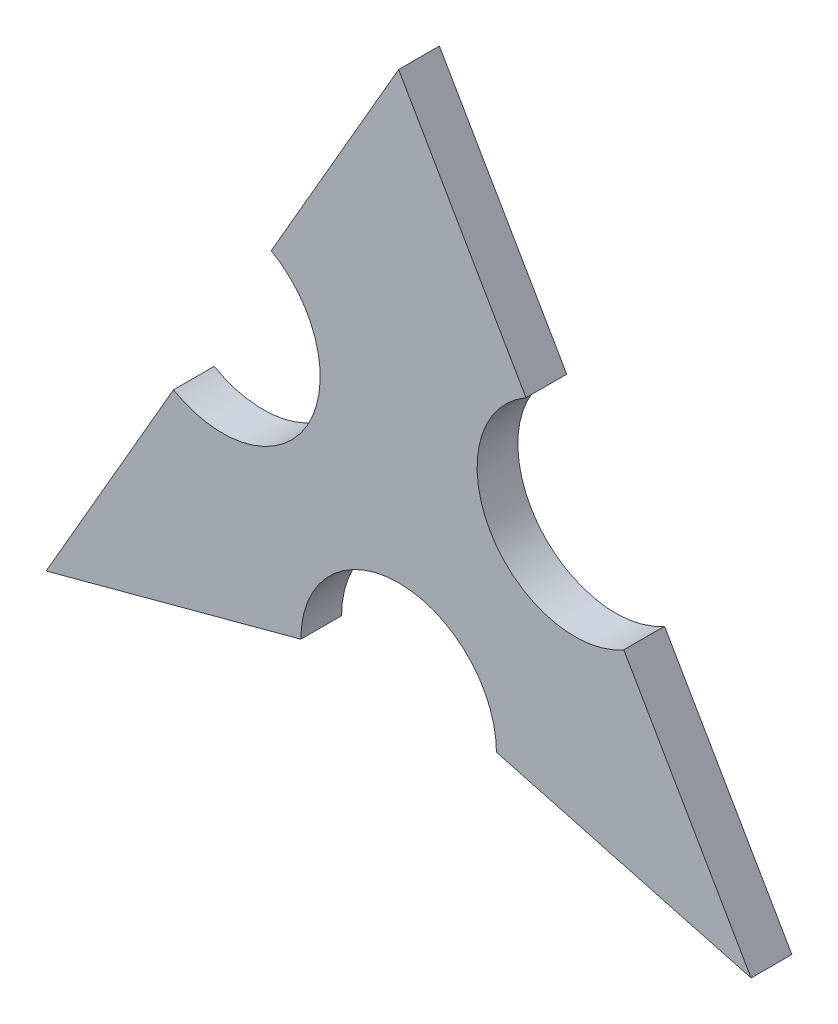
ISO-10303-21;
HEADER;
FILE_DESCRIPTION(('STEP AP214'),'2;1');
FILE_NAME('part.step','',(''),(''),'','','');
FILE_SCHEMA(('AUTOMOTIVE_DESIGN { 1 0 10303 214 1 1 1 1 }'));
ENDSEC;
DATA;
#1=APPLICATION_CONTEXT('core data for automotive mechanical design processes');
#2=APPLICATION_PROTOCOL_DEFINITION('international standard','automotive_design',2000,#1);
#3=PRODUCT_CONTEXT('',#1,'mechanical');
#4=PRODUCT('Part','Part','',(#3));
#5=PRODUCT_RELATED_PRODUCT_CATEGORY('part','',(#4));
#6=PRODUCT_DEFINITION_FORMATION('','',#4);
#7=PRODUCT_DEFINITION_CONTEXT('part definition',#1,'design');
#8=PRODUCT_DEFINITION('design','',#6,#7);
#9=PRODUCT_DEFINITION_SHAPE('','',#8);
#10=(LENGTH_UNIT() NAMED_UNIT(*) SI_UNIT(.MILLI.,.METRE.));
#11=(NAMED_UNIT(*) PLANE_ANGLE_UNIT() SI_UNIT($,.RADIAN.));
#12=(NAMED_UNIT(*) SI_UNIT($,.STERADIAN.) SOLID_ANGLE_UNIT());
#13=UNCERTAINTY_MEASURE_WITH_UNIT(LENGTH_MEASURE(1.E-05),#10,'distance_accuracy_value','');
#14=(GEOMETRIC_REPRESENTATION_CONTEXT(3) GLOBAL_UNCERTAINTY_ASSIGNED_CONTEXT((#13)) GLOBAL_UNIT_ASSIGNED_CONTEXT((#10,
#11,#12)) REPRESENTATION_CONTEXT('',''));
#15=CARTESIAN_POINT('',(0.,0.,0.));
#16=DIRECTION('',(0.,0.,1.));
#17=DIRECTION('',(1.,0.,0.));
#18=AXIS2_PLACEMENT_3D('',#15,#16,#17);
#19=CARTESIAN_POINT('',(0.,149.822394854708,5.));
#20=DIRECTION('',(-0.866025403784439,-0.5,0.));
#21=DIRECTION('',(0.5,-0.866025403784439,0.));
#22=AXIS2_PLACEMENT_3D('',#19,#20,#21);
#23=PLANE('',#22);
#24=DIRECTION('',(-0.5,0.866025403784439,0.));
#25=VECTOR('',#24,1.);
#26=CARTESIAN_POINT('',(0.,149.822394854708,-5.));
#27=LINE('',#26,#25);
#28=CARTESIAN_POINT('',(31.25,95.6958071181804,-5.));
#29=VERTEX_POINT('',#28);
#30=CARTESIAN_POINT('',(0.,149.822394854708,-5.));
#31=VERTEX_POINT('',#30);
#32=EDGE_CURVE('E143',#29,#31,#27,.T.);
#33=ORIENTED_EDGE('',*,*,#32,.T.);
#34=DIRECTION('',(0.,0.,-1.));
#35=VECTOR('',#34,1.);
#36=CARTESIAN_POINT('',(0.,149.822394854708,5.));
#37=LINE('',#36,#35);
#38=CARTESIAN_POINT('',(0.,149.822394854708,5.));
#39=VERTEX_POINT('',#38);
#40=EDGE_CURVE('E11',#39,#31,#37,.T.);
#41=ORIENTED_EDGE('',*,*,#40,.F.);
#42=DIRECTION('',(-0.5,0.866025403784439,0.));
#43=VECTOR('',#42,1.);
#44=CARTESIAN_POINT('',(0.,149.822394854708,5.));
#45=LINE('',#44,#43);
#46=CARTESIAN_POINT('',(31.25,95.6958071181804,5.));
#47=VERTEX_POINT('',#46);
#48=EDGE_CURVE('E159',#47,#39,#45,.T.);
#49=ORIENTED_EDGE('',*,*,#48,.F.);
#50=DIRECTION('',(0.,0.,-1.));
#51=VECTOR('',#50,1.);
#52=CARTESIAN_POINT('',(31.25,95.6958071181804,5.));
#53=LINE('',#52,#51);
#54=EDGE_CURVE('E139',#47,#29,#53,.T.);
#55=ORIENTED_EDGE('',*,*,#54,.T.);
#56=EDGE_LOOP('',(#33,#41,#49,#55));
#57=FACE_BOUND('',#56,.T.);
#58=ADVANCED_FACE('F41',(#57),#23,.F.);
#59=CARTESIAN_POINT('',(0.,149.822394854708,5.));
#60=DIRECTION('',(0.866025403784439,-0.5,0.));
#61=DIRECTION('',(0.5,0.866025403784439,0.));
#62=AXIS2_PLACEMENT_3D('',#59,#60,#61);
#63=PLANE('',#62);
#64=DIRECTION('',(-0.5,-0.866025403784439,0.));
#65=VECTOR('',#64,1.);
#66=CARTESIAN_POINT('',(0.,149.822394854708,-5.));
#67=LINE('',#66,#65);
#68=CARTESIAN_POINT('',(-31.25,95.6958071181804,-5.));
#69=VERTEX_POINT('',#68);
#70=EDGE_CURVE('E146',#31,#69,#67,.T.);
#71=ORIENTED_EDGE('',*,*,#70,.T.);
#72=DIRECTION('',(0.,0.,-1.));
#73=VECTOR('',#72,1.);
#74=CARTESIAN_POINT('',(-31.25,95.6958071181804,5.));
#75=LINE('',#74,#73);
#76=CARTESIAN_POINT('',(-31.25,95.6958071181804,5.));
#77=VERTEX_POINT('',#76);
#78=EDGE_CURVE('E49',#77,#69,#75,.T.);
#79=ORIENTED_EDGE('',*,*,#78,.F.);
#80=DIRECTION('',(-0.5,-0.866025403784439,0.));
#81=VECTOR('',#80,1.);
#82=CARTESIAN_POINT('',(0.,149.822394854708,5.));
#83=LINE('',#82,#81);
#84=EDGE_CURVE('E103',#39,#77,#83,.T.);
#85=ORIENTED_EDGE('',*,*,#84,.F.);
#86=ORIENTED_EDGE('',*,*,#40,.T.);
#87=EDGE_LOOP('',(#71,#79,#85,#86));
#88=FACE_BOUND('',#87,.T.);
#89=ADVANCED_FACE('F202',(#88),#63,.F.);
#90=CARTESIAN_POINT('',(-43.25,74.9111974273539,5.));
#91=DIRECTION('',(0.,0.,-1.));
#92=DIRECTION('',(-1.,0.,0.));
#93=AXIS2_PLACEMENT_3D('',#90,#91,#92);
#94=CYLINDRICAL_SURFACE('',#93,24.);
#95=CARTESIAN_POINT('',(-43.25,74.9111974273539,-5.));
#96=DIRECTION('',(0.,0.,-1.));
#97=DIRECTION('',(1.,0.,0.));
#98=AXIS2_PLACEMENT_3D('',#95,#96,#97);
#99=CIRCLE('',#98,24.);
#100=CARTESIAN_POINT('',(-55.25,54.1265877365274,-5.));
#101=VERTEX_POINT('',#100);
#102=EDGE_CURVE('E148',#69,#101,#99,.T.);
#103=ORIENTED_EDGE('',*,*,#102,.T.);
#104=DIRECTION('',(0.,0.,-1.));
#105=VECTOR('',#104,1.);
#106=CARTESIAN_POINT('',(-55.25,54.1265877365274,5.));
#107=LINE('',#106,#105);
#108=CARTESIAN_POINT('',(-55.25,54.1265877365274,5.));
#109=VERTEX_POINT('',#108);
#110=EDGE_CURVE('E169',#109,#101,#107,.T.);
#111=ORIENTED_EDGE('',*,*,#110,.F.);
#112=CARTESIAN_POINT('',(-43.25,74.9111974273539,5.));
#113=DIRECTION('',(0.,0.,-1.));
#114=DIRECTION('',(1.,0.,0.));
#115=AXIS2_PLACEMENT_3D('',#112,#113,#114);
#116=CIRCLE('',#115,24.);
#117=EDGE_CURVE('E177',#77,#109,#116,.T.);
#118=ORIENTED_EDGE('',*,*,#117,.F.);
#119=ORIENTED_EDGE('',*,*,#78,.T.);
#120=EDGE_LOOP('',(#103,#111,#118,#119));
#121=FACE_BOUND('',#120,.T.);
#122=ADVANCED_FACE('F175',(#121),#94,.F.);
#123=CARTESIAN_POINT('',(-55.25,54.1265877365274,5.));
#124=DIRECTION('',(0.866025403784439,-0.5,0.));
#125=DIRECTION('',(0.5,0.866025403784439,0.));
#126=AXIS2_PLACEMENT_3D('',#123,#124,#125);
#127=PLANE('',#126);
#128=DIRECTION('',(-0.5,-0.866025403784439,0.));
#129=VECTOR('',#128,1.);
#130=CARTESIAN_POINT('',(-55.25,54.1265877365274,-5.));
#131=LINE('',#130,#129);
#132=CARTESIAN_POINT('',(-86.5,0.,-5.));
#133=VERTEX_POINT('',#132);
#134=EDGE_CURVE('E150',#101,#133,#131,.T.);
#135=ORIENTED_EDGE('',*,*,#134,.T.);
#136=DIRECTION('',(0.,0.,-1.));
#137=VECTOR('',#136,1.);
#138=CARTESIAN_POINT('',(-86.5,0.,5.));
#139=LINE('',#138,#137);
#140=CARTESIAN_POINT('',(-86.5,0.,5.));
#141=VERTEX_POINT('',#140);
#142=EDGE_CURVE('E166',#141,#133,#139,.T.);
#143=ORIENTED_EDGE('',*,*,#142,.F.);
#144=DIRECTION('',(-0.5,-0.866025403784439,0.));
#145=VECTOR('',#144,1.);
#146=CARTESIAN_POINT('',(-55.25,54.1265877365274,5.));
#147=LINE('',#146,#145);
#148=EDGE_CURVE('E193',#109,#141,#147,.T.);
#149=ORIENTED_EDGE('',*,*,#148,.F.);
#150=ORIENTED_EDGE('',*,*,#110,.T.);
#151=EDGE_LOOP('',(#135,#143,#149,#150));
#152=FACE_BOUND('',#151,.T.);
#153=ADVANCED_FACE('F186',(#152),#127,.F.);
#154=CARTESIAN_POINT('',(-86.5,0.,5.));
#155=DIRECTION('',(-0.258819045102527,0.965925826289067,0.));
#156=DIRECTION('',(-0.965925826289067,-0.258819045102527,0.));
#157=AXIS2_PLACEMENT_3D('',#154,#155,#156);
#158=PLANE('',#157);
#159=DIRECTION('',(0.965925826289067,0.258819045102527,0.));
#160=VECTOR('',#159,1.);
#161=CARTESIAN_POINT('',(-86.5,0.,-5.));
#162=LINE('',#161,#160);
#163=CARTESIAN_POINT('',(-24.,16.7468245269456,-5.));
#164=VERTEX_POINT('',#163);
#165=EDGE_CURVE('E152',#133,#164,#162,.T.);
#166=ORIENTED_EDGE('',*,*,#165,.T.);
#167=DIRECTION('',(0.,0.,-1.));
#168=VECTOR('',#167,1.);
#169=CARTESIAN_POINT('',(-24.,16.7468245269456,5.));
#170=LINE('',#169,#168);
#171=CARTESIAN_POINT('',(-24.,16.7468245269456,5.));
#172=VERTEX_POINT('',#171);
#173=EDGE_CURVE('E163',#172,#164,#170,.T.);
#174=ORIENTED_EDGE('',*,*,#173,.F.);
#175=DIRECTION('',(0.965925826289067,0.258819045102527,0.));
#176=VECTOR('',#175,1.);
#177=CARTESIAN_POINT('',(-86.5,0.,5.));
#178=LINE('',#177,#176);
#179=EDGE_CURVE('E192',#141,#172,#178,.T.);
#180=ORIENTED_EDGE('',*,*,#179,.F.);
#181=ORIENTED_EDGE('',*,*,#142,.T.);
#182=EDGE_LOOP('',(#166,#174,#180,#181));
#183=FACE_BOUND('',#182,.T.);
#184=ADVANCED_FACE('F190',(#183),#158,.F.);
#185=CARTESIAN_POINT('',(0.,16.7468245269456,5.));
#186=DIRECTION('',(0.,0.,-1.));
#187=DIRECTION('',(-1.,0.,0.));
#188=AXIS2_PLACEMENT_3D('',#185,#186,#187);
#189=CYLINDRICAL_SURFACE('',#188,24.);
#190=CARTESIAN_POINT('',(0.,16.7468245269456,-5.));
#191=DIRECTION('',(0.,0.,-1.));
#192=DIRECTION('',(1.,0.,0.));
#193=AXIS2_PLACEMENT_3D('',#190,#191,#192);
#194=CIRCLE('',#193,24.);
#195=CARTESIAN_POINT('',(24.,16.7468245269455,-5.));
#196=VERTEX_POINT('',#195);
#197=EDGE_CURVE('E154',#164,#196,#194,.T.);
#198=ORIENTED_EDGE('',*,*,#197,.T.);
#199=DIRECTION('',(0.,0.,-1.));
#200=VECTOR('',#199,1.);
#201=CARTESIAN_POINT('',(24.,16.7468245269455,5.));
#202=LINE('',#201,#200);
#203=CARTESIAN_POINT('',(24.,16.7468245269455,5.));
#204=VERTEX_POINT('',#203);
#205=EDGE_CURVE('E134',#204,#196,#202,.T.);
#206=ORIENTED_EDGE('',*,*,#205,.F.);
#207=CARTESIAN_POINT('',(0.,16.7468245269456,5.));
#208=DIRECTION('',(0.,0.,-1.));
#209=DIRECTION('',(1.,0.,0.));
#210=AXIS2_PLACEMENT_3D('',#207,#208,#209);
#211=CIRCLE('',#210,24.);
#212=EDGE_CURVE('E125',#172,#204,#211,.T.);
#213=ORIENTED_EDGE('',*,*,#212,.F.);
#214=ORIENTED_EDGE('',*,*,#173,.T.);
#215=EDGE_LOOP('',(#198,#206,#213,#214));
#216=FACE_BOUND('',#215,.T.);
#217=ADVANCED_FACE('F214',(#216),#189,.F.);
#218=CARTESIAN_POINT('',(86.5,0.,5.));
#219=DIRECTION('',(0.258819045102526,0.965925826289067,0.));
#220=DIRECTION('',(-0.965925826289067,0.258819045102526,0.));
#221=AXIS2_PLACEMENT_3D('',#218,#219,#220);
#222=PLANE('',#221);
#223=DIRECTION('',(0.965925826289067,-0.258819045102526,0.));
#224=VECTOR('',#223,1.);
#225=CARTESIAN_POINT('',(86.5,0.,-5.));
#226=LINE('',#225,#224);
#227=CARTESIAN_POINT('',(86.5,0.,-5.));
#228=VERTEX_POINT('',#227);
#229=EDGE_CURVE('E133',#196,#228,#226,.T.);
#230=ORIENTED_EDGE('',*,*,#229,.T.);
#231=DIRECTION('',(0.,0.,-1.));
#232=VECTOR('',#231,1.);
#233=CARTESIAN_POINT('',(86.5,0.,5.));
#234=LINE('',#233,#232);
#235=CARTESIAN_POINT('',(86.5,0.,5.));
#236=VERTEX_POINT('',#235);
#237=EDGE_CURVE('E130',#236,#228,#234,.T.);
#238=ORIENTED_EDGE('',*,*,#237,.F.);
#239=DIRECTION('',(0.965925826289067,-0.258819045102526,0.));
#240=VECTOR('',#239,1.);
#241=CARTESIAN_POINT('',(86.5,0.,5.));
#242=LINE('',#241,#240);
#243=EDGE_CURVE('E119',#204,#236,#242,.T.);
#244=ORIENTED_EDGE('',*,*,#243,.F.);
#245=ORIENTED_EDGE('',*,*,#205,.T.);
#246=EDGE_LOOP('',(#230,#238,#244,#245));
#247=FACE_BOUND('',#246,.T.);
#248=ADVANCED_FACE('F131',(#247),#222,.F.);
#249=CARTESIAN_POINT('',(55.25,54.1265877365274,5.));
#250=DIRECTION('',(-0.866025403784439,-0.5,0.));
#251=DIRECTION('',(0.5,-0.866025403784439,0.));
#252=AXIS2_PLACEMENT_3D('',#249,#250,#251);
#253=PLANE('',#252);
#254=DIRECTION('',(-0.5,0.866025403784439,0.));
#255=VECTOR('',#254,1.);
#256=CARTESIAN_POINT('',(55.25,54.1265877365274,-5.));
#257=LINE('',#256,#255);
#258=CARTESIAN_POINT('',(55.25,54.1265877365274,-5.));
#259=VERTEX_POINT('',#258);
#260=EDGE_CURVE('E89',#228,#259,#257,.T.);
#261=ORIENTED_EDGE('',*,*,#260,.T.);
#262=DIRECTION('',(0.,0.,-1.));
#263=VECTOR('',#262,1.);
#264=CARTESIAN_POINT('',(55.25,54.1265877365274,5.));
#265=LINE('',#264,#263);
#266=CARTESIAN_POINT('',(55.25,54.1265877365274,5.));
#267=VERTEX_POINT('',#266);
#268=EDGE_CURVE('E135',#267,#259,#265,.T.);
#269=ORIENTED_EDGE('',*,*,#268,.F.);
#270=DIRECTION('',(-0.5,0.866025403784439,0.));
#271=VECTOR('',#270,1.);
#272=CARTESIAN_POINT('',(55.25,54.1265877365274,5.));
#273=LINE('',#272,#271);
#274=EDGE_CURVE('E123',#236,#267,#273,.T.);
#275=ORIENTED_EDGE('',*,*,#274,.F.);
#276=ORIENTED_EDGE('',*,*,#237,.T.);
#277=EDGE_LOOP('',(#261,#269,#275,#276));
#278=FACE_BOUND('',#277,.T.);
#279=ADVANCED_FACE('F137',(#278),#253,.F.);
#280=CARTESIAN_POINT('',(43.25,74.9111974273539,5.));
#281=DIRECTION('',(0.,0.,-1.));
#282=DIRECTION('',(-1.,0.,0.));
#283=AXIS2_PLACEMENT_3D('',#280,#281,#282);
#284=CYLINDRICAL_SURFACE('',#283,24.);
#285=CARTESIAN_POINT('',(43.25,74.9111974273539,-5.));
#286=DIRECTION('',(0.,0.,-1.));
#287=DIRECTION('',(-1.,0.,0.));
#288=AXIS2_PLACEMENT_3D('',#285,#286,#287);
#289=CIRCLE('',#288,24.);
#290=EDGE_CURVE('E95',#259,#29,#289,.T.);
#291=ORIENTED_EDGE('',*,*,#290,.T.);
#292=ORIENTED_EDGE('',*,*,#54,.F.);
#293=CARTESIAN_POINT('',(43.25,74.9111974273539,5.));
#294=DIRECTION('',(0.,0.,-1.));
#295=DIRECTION('',(-1.,0.,0.));
#296=AXIS2_PLACEMENT_3D('',#293,#294,#295);
#297=CIRCLE('',#296,24.);
#298=EDGE_CURVE('E57',#267,#47,#297,.T.);
#299=ORIENTED_EDGE('',*,*,#298,.F.);
#300=ORIENTED_EDGE('',*,*,#268,.T.);
#301=EDGE_LOOP('',(#291,#292,#299,#300));
#302=FACE_BOUND('',#301,.T.);
#303=ADVANCED_FACE('F222',(#302),#284,.F.);
#304=CARTESIAN_POINT('',(43.25,74.9111974273539,5.));
#305=DIRECTION('',(0.,0.,-1.));
#306=DIRECTION('',(-1.,0.,0.));
#307=AXIS2_PLACEMENT_3D('',#304,#305,#306);
#308=PLANE('',#307);
#309=ORIENTED_EDGE('',*,*,#48,.T.);
#310=ORIENTED_EDGE('',*,*,#84,.T.);
#311=ORIENTED_EDGE('',*,*,#117,.T.);
#312=ORIENTED_EDGE('',*,*,#148,.T.);
#313=ORIENTED_EDGE('',*,*,#179,.T.);
#314=ORIENTED_EDGE('',*,*,#212,.T.);
#315=ORIENTED_EDGE('',*,*,#243,.T.);
#316=ORIENTED_EDGE('',*,*,#274,.T.);
#317=ORIENTED_EDGE('',*,*,#298,.T.);
#318=EDGE_LOOP('',(#309,#310,#311,#312,#313,#314,#315,#316,#317));
#319=FACE_BOUND('',#318,.T.);
#320=ADVANCED_FACE('F121',(#319),#308,.F.);
#321=CARTESIAN_POINT('',(43.25,74.9111974273539,-5.));
#322=DIRECTION('',(0.,0.,-1.));
#323=DIRECTION('',(-1.,0.,0.));
#324=AXIS2_PLACEMENT_3D('',#321,#322,#323);
#325=PLANE('',#324);
#326=ORIENTED_EDGE('',*,*,#32,.F.);
#327=ORIENTED_EDGE('',*,*,#290,.F.);
#328=ORIENTED_EDGE('',*,*,#260,.F.);
#329=ORIENTED_EDGE('',*,*,#229,.F.);
#330=ORIENTED_EDGE('',*,*,#197,.F.);
#331=ORIENTED_EDGE('',*,*,#165,.F.);
#332=ORIENTED_EDGE('',*,*,#134,.F.);
#333=ORIENTED_EDGE('',*,*,#102,.F.);
#334=ORIENTED_EDGE('',*,*,#70,.F.);
#335=EDGE_LOOP('',(#326,#327,#328,#329,#330,#331,#332,#333,#334));
#336=FACE_BOUND('',#335,.T.);
#337=ADVANCED_FACE('F181',(#336),#325,.T.);
#338=CLOSED_SHELL('',(#58,#89,#122,#153,#184,#217,#248,#279,#303,#320,#337));
#339=MANIFOLD_SOLID_BREP('B2',#338);
#340=ADVANCED_BREP_SHAPE_REPRESENTATION('',(#18,#339),#14);
#341=SHAPE_DEFINITION_REPRESENTATION(#9,#340);
ENDSEC;
END-ISO-10303-21;
